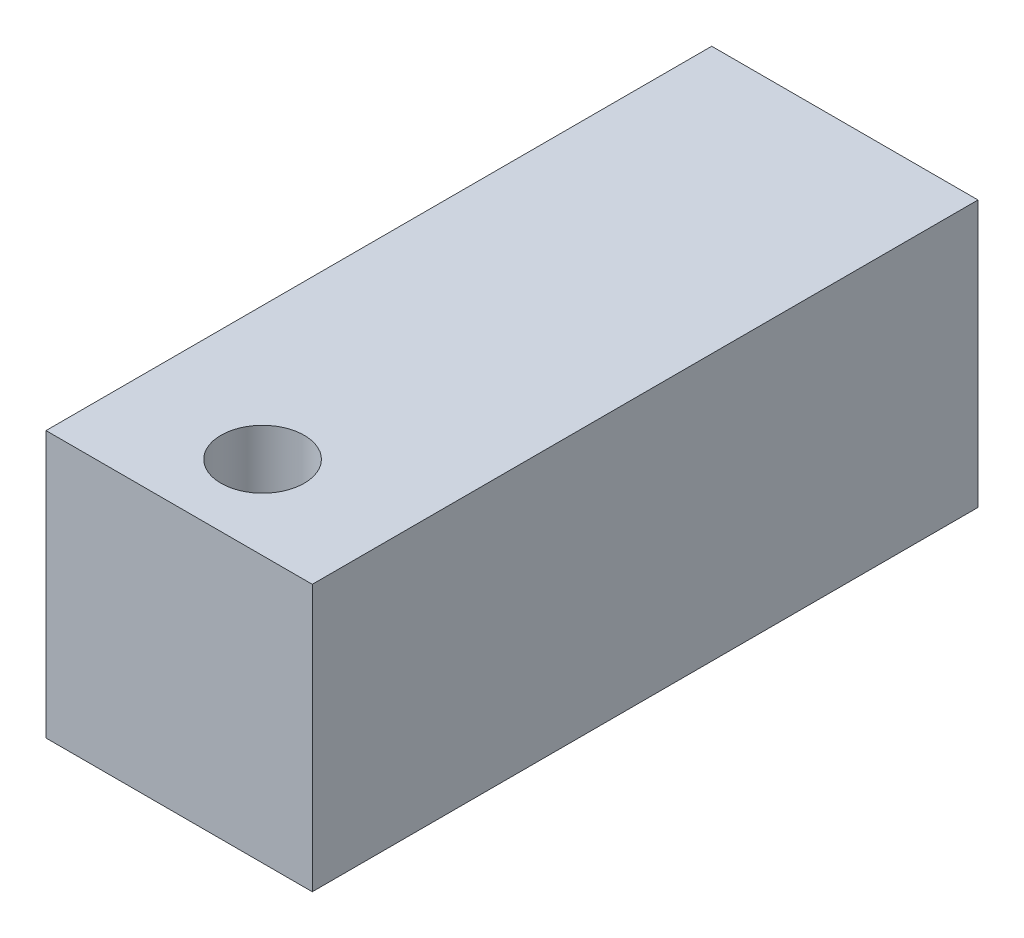
ISO-10303-21;
HEADER;
FILE_DESCRIPTION(('STEP AP214'),'2;1');
FILE_NAME('part.step','',(''),(''),'','','');
FILE_SCHEMA(('AUTOMOTIVE_DESIGN { 1 0 10303 214 1 1 1 1 }'));
ENDSEC;
DATA;
#1=APPLICATION_CONTEXT('core data for automotive mechanical design processes');
#2=APPLICATION_PROTOCOL_DEFINITION('international standard','automotive_design',2000,#1);
#3=PRODUCT_CONTEXT('',#1,'mechanical');
#4=PRODUCT('Part','Part','',(#3));
#5=PRODUCT_RELATED_PRODUCT_CATEGORY('part','',(#4));
#6=PRODUCT_DEFINITION_FORMATION('','',#4);
#7=PRODUCT_DEFINITION_CONTEXT('part definition',#1,'design');
#8=PRODUCT_DEFINITION('design','',#6,#7);
#9=PRODUCT_DEFINITION_SHAPE('','',#8);
#10=(LENGTH_UNIT() NAMED_UNIT(*) SI_UNIT(.MILLI.,.METRE.));
#11=(NAMED_UNIT(*) PLANE_ANGLE_UNIT() SI_UNIT($,.RADIAN.));
#12=(NAMED_UNIT(*) SI_UNIT($,.STERADIAN.) SOLID_ANGLE_UNIT());
#13=UNCERTAINTY_MEASURE_WITH_UNIT(LENGTH_MEASURE(1.E-05),#10,'distance_accuracy_value','');
#14=(GEOMETRIC_REPRESENTATION_CONTEXT(3) GLOBAL_UNCERTAINTY_ASSIGNED_CONTEXT((#13)) GLOBAL_UNIT_ASSIGNED_CONTEXT((#10,
#11,#12)) REPRESENTATION_CONTEXT('',''));
#15=CARTESIAN_POINT('',(0.,0.,0.));
#16=DIRECTION('',(0.,0.,1.));
#17=DIRECTION('',(1.,0.,0.));
#18=AXIS2_PLACEMENT_3D('',#15,#16,#17);
#19=CARTESIAN_POINT('',(1.905,3.81,4.7625));
#20=DIRECTION('',(-1.,0.,0.));
#21=DIRECTION('',(0.,0.,1.));
#22=AXIS2_PLACEMENT_3D('',#19,#20,#21);
#23=PLANE('',#22);
#24=DIRECTION('',(0.,0.,-1.));
#25=VECTOR('',#24,1.);
#26=CARTESIAN_POINT('',(1.905,0.,4.7625));
#27=LINE('',#26,#25);
#28=CARTESIAN_POINT('',(1.905,0.,4.7625));
#29=VERTEX_POINT('',#28);
#30=CARTESIAN_POINT('',(1.905,0.,-4.7625));
#31=VERTEX_POINT('',#30);
#32=EDGE_CURVE('E109',#29,#31,#27,.T.);
#33=ORIENTED_EDGE('',*,*,#32,.T.);
#34=DIRECTION('',(0.,-1.,0.));
#35=VECTOR('',#34,1.);
#36=CARTESIAN_POINT('',(1.905,3.81,-4.7625));
#37=LINE('',#36,#35);
#38=CARTESIAN_POINT('',(1.905,3.81,-4.7625));
#39=VERTEX_POINT('',#38);
#40=EDGE_CURVE('E11',#39,#31,#37,.T.);
#41=ORIENTED_EDGE('',*,*,#40,.F.);
#42=DIRECTION('',(0.,0.,-1.));
#43=VECTOR('',#42,1.);
#44=CARTESIAN_POINT('',(1.905,3.81,4.7625));
#45=LINE('',#44,#43);
#46=CARTESIAN_POINT('',(1.905,3.81,4.7625));
#47=VERTEX_POINT('',#46);
#48=EDGE_CURVE('E93',#47,#39,#45,.T.);
#49=ORIENTED_EDGE('',*,*,#48,.F.);
#50=DIRECTION('',(0.,-1.,0.));
#51=VECTOR('',#50,1.);
#52=CARTESIAN_POINT('',(1.905,3.81,4.7625));
#53=LINE('',#52,#51);
#54=EDGE_CURVE('E105',#47,#29,#53,.T.);
#55=ORIENTED_EDGE('',*,*,#54,.T.);
#56=EDGE_LOOP('',(#33,#41,#49,#55));
#57=FACE_BOUND('',#56,.T.);
#58=ADVANCED_FACE('F41',(#57),#23,.F.);
#59=CARTESIAN_POINT('',(-1.905,3.81,-4.7625));
#60=DIRECTION('',(0.,0.,1.));
#61=DIRECTION('',(1.,0.,0.));
#62=AXIS2_PLACEMENT_3D('',#59,#60,#61);
#63=PLANE('',#62);
#64=DIRECTION('',(-1.,0.,0.));
#65=VECTOR('',#64,1.);
#66=CARTESIAN_POINT('',(-1.905,0.,-4.7625));
#67=LINE('',#66,#65);
#68=CARTESIAN_POINT('',(-1.905,0.,-4.7625));
#69=VERTEX_POINT('',#68);
#70=EDGE_CURVE('E98',#31,#69,#67,.T.);
#71=ORIENTED_EDGE('',*,*,#70,.T.);
#72=DIRECTION('',(0.,-1.,0.));
#73=VECTOR('',#72,1.);
#74=CARTESIAN_POINT('',(-1.905,3.81,-4.7625));
#75=LINE('',#74,#73);
#76=CARTESIAN_POINT('',(-1.905,3.81,-4.7625));
#77=VERTEX_POINT('',#76);
#78=EDGE_CURVE('E50',#77,#69,#75,.T.);
#79=ORIENTED_EDGE('',*,*,#78,.F.);
#80=DIRECTION('',(-1.,0.,0.));
#81=VECTOR('',#80,1.);
#82=CARTESIAN_POINT('',(-1.905,3.81,-4.7625));
#83=LINE('',#82,#81);
#84=EDGE_CURVE('E88',#39,#77,#83,.T.);
#85=ORIENTED_EDGE('',*,*,#84,.F.);
#86=ORIENTED_EDGE('',*,*,#40,.T.);
#87=EDGE_LOOP('',(#71,#79,#85,#86));
#88=FACE_BOUND('',#87,.T.);
#89=ADVANCED_FACE('F97',(#88),#63,.F.);
#90=CARTESIAN_POINT('',(-1.905,3.81,4.7625));
#91=DIRECTION('',(1.,0.,0.));
#92=DIRECTION('',(0.,0.,-1.));
#93=AXIS2_PLACEMENT_3D('',#90,#91,#92);
#94=PLANE('',#93);
#95=DIRECTION('',(0.,0.,1.));
#96=VECTOR('',#95,1.);
#97=CARTESIAN_POINT('',(-1.905,0.,4.7625));
#98=LINE('',#97,#96);
#99=CARTESIAN_POINT('',(-1.905,0.,4.7625));
#100=VERTEX_POINT('',#99);
#101=EDGE_CURVE('E75',#69,#100,#98,.T.);
#102=ORIENTED_EDGE('',*,*,#101,.T.);
#103=DIRECTION('',(0.,-1.,0.));
#104=VECTOR('',#103,1.);
#105=CARTESIAN_POINT('',(-1.905,3.81,4.7625));
#106=LINE('',#105,#104);
#107=CARTESIAN_POINT('',(-1.905,3.81,4.7625));
#108=VERTEX_POINT('',#107);
#109=EDGE_CURVE('E100',#108,#100,#106,.T.);
#110=ORIENTED_EDGE('',*,*,#109,.F.);
#111=DIRECTION('',(0.,0.,1.));
#112=VECTOR('',#111,1.);
#113=CARTESIAN_POINT('',(-1.905,3.81,4.7625));
#114=LINE('',#113,#112);
#115=EDGE_CURVE('E91',#77,#108,#114,.T.);
#116=ORIENTED_EDGE('',*,*,#115,.F.);
#117=ORIENTED_EDGE('',*,*,#78,.T.);
#118=EDGE_LOOP('',(#102,#110,#116,#117));
#119=FACE_BOUND('',#118,.T.);
#120=ADVANCED_FACE('F101',(#119),#94,.F.);
#121=CARTESIAN_POINT('',(-1.905,3.81,4.7625));
#122=DIRECTION('',(0.,0.,-1.));
#123=DIRECTION('',(-1.,0.,0.));
#124=AXIS2_PLACEMENT_3D('',#121,#122,#123);
#125=PLANE('',#124);
#126=DIRECTION('',(1.,0.,0.));
#127=VECTOR('',#126,1.);
#128=CARTESIAN_POINT('',(-1.905,0.,4.7625));
#129=LINE('',#128,#127);
#130=EDGE_CURVE('E81',#100,#29,#129,.T.);
#131=ORIENTED_EDGE('',*,*,#130,.T.);
#132=ORIENTED_EDGE('',*,*,#54,.F.);
#133=DIRECTION('',(1.,0.,0.));
#134=VECTOR('',#133,1.);
#135=CARTESIAN_POINT('',(-1.905,3.81,4.7625));
#136=LINE('',#135,#134);
#137=EDGE_CURVE('E58',#108,#47,#136,.T.);
#138=ORIENTED_EDGE('',*,*,#137,.F.);
#139=ORIENTED_EDGE('',*,*,#109,.T.);
#140=EDGE_LOOP('',(#131,#132,#138,#139));
#141=FACE_BOUND('',#140,.T.);
#142=ADVANCED_FACE('F123',(#141),#125,.F.);
#143=CARTESIAN_POINT('',(0.,3.81,0.));
#144=DIRECTION('',(0.,-1.,0.));
#145=DIRECTION('',(0.,0.,-1.));
#146=AXIS2_PLACEMENT_3D('',#143,#144,#145);
#147=PLANE('',#146);
#148=CARTESIAN_POINT('',(0.,3.81,3.5687));
#149=DIRECTION('',(0.,1.,0.));
#150=DIRECTION('',(0.,0.,1.));
#151=AXIS2_PLACEMENT_3D('',#148,#149,#150);
#152=CIRCLE('',#151,0.595629999999999);
#153=CARTESIAN_POINT('',(0.,3.81,4.16433));
#154=VERTEX_POINT('',#153);
#155=EDGE_CURVE('E133',#154,#154,#152,.T.);
#156=ORIENTED_EDGE('',*,*,#155,.F.);
#157=EDGE_LOOP('',(#156));
#158=FACE_BOUND('',#157,.T.);
#159=ORIENTED_EDGE('',*,*,#48,.T.);
#160=ORIENTED_EDGE('',*,*,#84,.T.);
#161=ORIENTED_EDGE('',*,*,#115,.T.);
#162=ORIENTED_EDGE('',*,*,#137,.T.);
#163=EDGE_LOOP('',(#159,#160,#161,#162));
#164=FACE_BOUND('',#163,.T.);
#165=ADVANCED_FACE('F89',(#158,#164),#147,.F.);
#166=CARTESIAN_POINT('',(0.,0.,0.));
#167=DIRECTION('',(0.,-1.,0.));
#168=DIRECTION('',(0.,0.,-1.));
#169=AXIS2_PLACEMENT_3D('',#166,#167,#168);
#170=PLANE('',#169);
#171=CARTESIAN_POINT('',(0.,0.,3.5687));
#172=DIRECTION('',(0.,1.,0.));
#173=DIRECTION('',(0.,0.,1.));
#174=AXIS2_PLACEMENT_3D('',#171,#172,#173);
#175=CIRCLE('',#174,0.595629999999999);
#176=CARTESIAN_POINT('',(0.,0.,4.16433));
#177=VERTEX_POINT('',#176);
#178=EDGE_CURVE('E113',#177,#177,#175,.T.);
#179=ORIENTED_EDGE('',*,*,#178,.T.);
#180=EDGE_LOOP('',(#179));
#181=FACE_BOUND('',#180,.T.);
#182=ORIENTED_EDGE('',*,*,#32,.F.);
#183=ORIENTED_EDGE('',*,*,#130,.F.);
#184=ORIENTED_EDGE('',*,*,#101,.F.);
#185=ORIENTED_EDGE('',*,*,#70,.F.);
#186=EDGE_LOOP('',(#182,#183,#184,#185));
#187=FACE_BOUND('',#186,.T.);
#188=ADVANCED_FACE('F126',(#181,#187),#170,.T.);
#189=CARTESIAN_POINT('',(0.,3.81,3.5687));
#190=DIRECTION('',(0.,1.,0.));
#191=DIRECTION('',(0.,0.,1.));
#192=AXIS2_PLACEMENT_3D('',#189,#190,#191);
#193=CYLINDRICAL_SURFACE('',#192,0.595629999999999);
#194=ORIENTED_EDGE('',*,*,#178,.F.);
#195=EDGE_LOOP('',(#194));
#196=FACE_BOUND('',#195,.T.);
#197=ORIENTED_EDGE('',*,*,#155,.T.);
#198=EDGE_LOOP('',(#197));
#199=FACE_BOUND('',#198,.T.);
#200=ADVANCED_FACE('F138',(#196,#199),#193,.F.);
#201=CLOSED_SHELL('',(#58,#89,#120,#142,#165,#188,#200));
#202=MANIFOLD_SOLID_BREP('B2',#201);
#203=ADVANCED_BREP_SHAPE_REPRESENTATION('',(#18,#202),#14);
#204=SHAPE_DEFINITION_REPRESENTATION(#9,#203);
ENDSEC;
END-ISO-10303-21;
